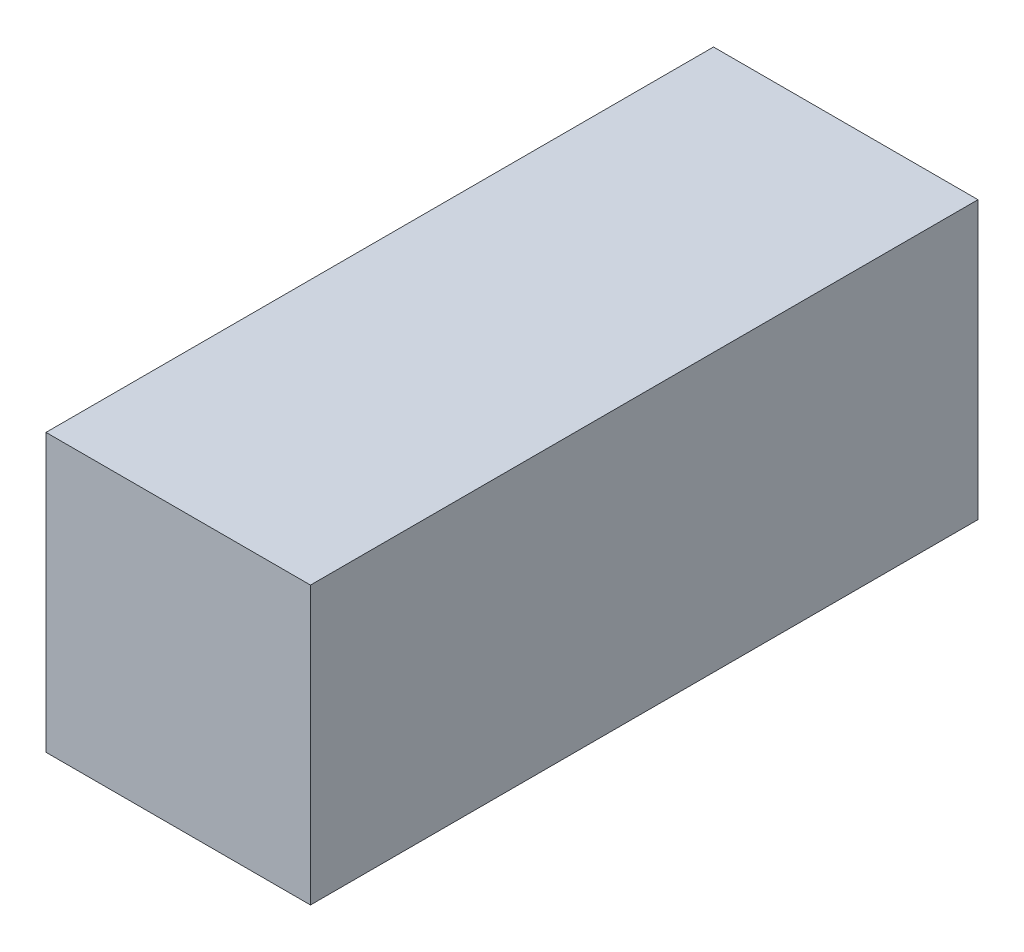
ISO-10303-21;
HEADER;
FILE_DESCRIPTION(('STEP AP214'),'2;1');
FILE_NAME('part.step','',(''),(''),'','','');
FILE_SCHEMA(('AUTOMOTIVE_DESIGN { 1 0 10303 214 1 1 1 1 }'));
ENDSEC;
DATA;
#1=APPLICATION_CONTEXT('core data for automotive mechanical design processes');
#2=APPLICATION_PROTOCOL_DEFINITION('international standard','automotive_design',2000,#1);
#3=PRODUCT_CONTEXT('',#1,'mechanical');
#4=PRODUCT('Part','Part','',(#3));
#5=PRODUCT_RELATED_PRODUCT_CATEGORY('part','',(#4));
#6=PRODUCT_DEFINITION_FORMATION('','',#4);
#7=PRODUCT_DEFINITION_CONTEXT('part definition',#1,'design');
#8=PRODUCT_DEFINITION('design','',#6,#7);
#9=PRODUCT_DEFINITION_SHAPE('','',#8);
#10=(LENGTH_UNIT() NAMED_UNIT(*) SI_UNIT(.MILLI.,.METRE.));
#11=(NAMED_UNIT(*) PLANE_ANGLE_UNIT() SI_UNIT($,.RADIAN.));
#12=(NAMED_UNIT(*) SI_UNIT($,.STERADIAN.) SOLID_ANGLE_UNIT());
#13=UNCERTAINTY_MEASURE_WITH_UNIT(LENGTH_MEASURE(1.E-05),#10,'distance_accuracy_value','');
#14=(GEOMETRIC_REPRESENTATION_CONTEXT(3) GLOBAL_UNCERTAINTY_ASSIGNED_CONTEXT((#13)) GLOBAL_UNIT_ASSIGNED_CONTEXT((#10,
#11,#12)) REPRESENTATION_CONTEXT('',''));
#15=CARTESIAN_POINT('',(0.,0.,0.));
#16=DIRECTION('',(0.,0.,1.));
#17=DIRECTION('',(1.,0.,0.));
#18=AXIS2_PLACEMENT_3D('',#15,#16,#17);
#19=CARTESIAN_POINT('',(0.,22.,0.));
#20=DIRECTION('',(1.,0.,0.));
#21=DIRECTION('',(0.,0.,-1.));
#22=AXIS2_PLACEMENT_3D('',#19,#20,#21);
#23=PLANE('',#22);
#24=DIRECTION('',(0.,0.,1.));
#25=VECTOR('',#24,1.);
#26=CARTESIAN_POINT('',(0.,0.,0.));
#27=LINE('',#26,#25);
#28=CARTESIAN_POINT('',(0.,0.,0.));
#29=VERTEX_POINT('',#28);
#30=CARTESIAN_POINT('',(0.,0.,53.));
#31=VERTEX_POINT('',#30);
#32=EDGE_CURVE('E105',#29,#31,#27,.T.);
#33=ORIENTED_EDGE('',*,*,#32,.T.);
#34=DIRECTION('',(0.,-1.,0.));
#35=VECTOR('',#34,1.);
#36=CARTESIAN_POINT('',(0.,22.,53.));
#37=LINE('',#36,#35);
#38=CARTESIAN_POINT('',(0.,22.,53.));
#39=VERTEX_POINT('',#38);
#40=EDGE_CURVE('E11',#39,#31,#37,.T.);
#41=ORIENTED_EDGE('',*,*,#40,.F.);
#42=DIRECTION('',(0.,0.,1.));
#43=VECTOR('',#42,1.);
#44=CARTESIAN_POINT('',(0.,22.,0.));
#45=LINE('',#44,#43);
#46=CARTESIAN_POINT('',(0.,22.,0.));
#47=VERTEX_POINT('',#46);
#48=EDGE_CURVE('E89',#47,#39,#45,.T.);
#49=ORIENTED_EDGE('',*,*,#48,.F.);
#50=DIRECTION('',(0.,-1.,0.));
#51=VECTOR('',#50,1.);
#52=CARTESIAN_POINT('',(0.,22.,0.));
#53=LINE('',#52,#51);
#54=EDGE_CURVE('E97',#47,#29,#53,.T.);
#55=ORIENTED_EDGE('',*,*,#54,.T.);
#56=EDGE_LOOP('',(#33,#41,#49,#55));
#57=FACE_BOUND('',#56,.T.);
#58=ADVANCED_FACE('F39',(#57),#23,.F.);
#59=CARTESIAN_POINT('',(0.,22.,53.));
#60=DIRECTION('',(0.,0.,-1.));
#61=DIRECTION('',(-1.,0.,0.));
#62=AXIS2_PLACEMENT_3D('',#59,#60,#61);
#63=PLANE('',#62);
#64=DIRECTION('',(1.,0.,0.));
#65=VECTOR('',#64,1.);
#66=CARTESIAN_POINT('',(0.,0.,53.));
#67=LINE('',#66,#65);
#68=CARTESIAN_POINT('',(21.,0.,53.));
#69=VERTEX_POINT('',#68);
#70=EDGE_CURVE('E92',#31,#69,#67,.T.);
#71=ORIENTED_EDGE('',*,*,#70,.T.);
#72=DIRECTION('',(0.,-1.,0.));
#73=VECTOR('',#72,1.);
#74=CARTESIAN_POINT('',(21.,22.,53.));
#75=LINE('',#74,#73);
#76=CARTESIAN_POINT('',(21.,22.,53.));
#77=VERTEX_POINT('',#76);
#78=EDGE_CURVE('E50',#77,#69,#75,.T.);
#79=ORIENTED_EDGE('',*,*,#78,.F.);
#80=DIRECTION('',(1.,0.,0.));
#81=VECTOR('',#80,1.);
#82=CARTESIAN_POINT('',(0.,22.,53.));
#83=LINE('',#82,#81);
#84=EDGE_CURVE('E82',#39,#77,#83,.T.);
#85=ORIENTED_EDGE('',*,*,#84,.F.);
#86=ORIENTED_EDGE('',*,*,#40,.T.);
#87=EDGE_LOOP('',(#71,#79,#85,#86));
#88=FACE_BOUND('',#87,.T.);
#89=ADVANCED_FACE('F93',(#88),#63,.F.);
#90=CARTESIAN_POINT('',(21.,22.,0.));
#91=DIRECTION('',(-1.,0.,0.));
#92=DIRECTION('',(0.,0.,1.));
#93=AXIS2_PLACEMENT_3D('',#90,#91,#92);
#94=PLANE('',#93);
#95=DIRECTION('',(0.,0.,-1.));
#96=VECTOR('',#95,1.);
#97=CARTESIAN_POINT('',(21.,0.,0.));
#98=LINE('',#97,#96);
#99=CARTESIAN_POINT('',(21.,0.,0.));
#100=VERTEX_POINT('',#99);
#101=EDGE_CURVE('E75',#69,#100,#98,.T.);
#102=ORIENTED_EDGE('',*,*,#101,.T.);
#103=DIRECTION('',(0.,-1.,0.));
#104=VECTOR('',#103,1.);
#105=CARTESIAN_POINT('',(21.,22.,0.));
#106=LINE('',#105,#104);
#107=CARTESIAN_POINT('',(21.,22.,0.));
#108=VERTEX_POINT('',#107);
#109=EDGE_CURVE('E94',#108,#100,#106,.T.);
#110=ORIENTED_EDGE('',*,*,#109,.F.);
#111=DIRECTION('',(0.,0.,-1.));
#112=VECTOR('',#111,1.);
#113=CARTESIAN_POINT('',(21.,22.,0.));
#114=LINE('',#113,#112);
#115=EDGE_CURVE('E88',#77,#108,#114,.T.);
#116=ORIENTED_EDGE('',*,*,#115,.F.);
#117=ORIENTED_EDGE('',*,*,#78,.T.);
#118=EDGE_LOOP('',(#102,#110,#116,#117));
#119=FACE_BOUND('',#118,.T.);
#120=ADVANCED_FACE('F96',(#119),#94,.F.);
#121=CARTESIAN_POINT('',(0.,22.,0.));
#122=DIRECTION('',(0.,0.,1.));
#123=DIRECTION('',(1.,0.,0.));
#124=AXIS2_PLACEMENT_3D('',#121,#122,#123);
#125=PLANE('',#124);
#126=DIRECTION('',(-1.,0.,0.));
#127=VECTOR('',#126,1.);
#128=CARTESIAN_POINT('',(0.,0.,0.));
#129=LINE('',#128,#127);
#130=EDGE_CURVE('E76',#100,#29,#129,.T.);
#131=ORIENTED_EDGE('',*,*,#130,.T.);
#132=ORIENTED_EDGE('',*,*,#54,.F.);
#133=DIRECTION('',(-1.,0.,0.));
#134=VECTOR('',#133,1.);
#135=CARTESIAN_POINT('',(0.,22.,0.));
#136=LINE('',#135,#134);
#137=EDGE_CURVE('E54',#108,#47,#136,.T.);
#138=ORIENTED_EDGE('',*,*,#137,.F.);
#139=ORIENTED_EDGE('',*,*,#109,.T.);
#140=EDGE_LOOP('',(#131,#132,#138,#139));
#141=FACE_BOUND('',#140,.T.);
#142=ADVANCED_FACE('F109',(#141),#125,.F.);
#143=CARTESIAN_POINT('',(0.,22.,0.));
#144=DIRECTION('',(0.,1.,0.));
#145=DIRECTION('',(0.,0.,1.));
#146=AXIS2_PLACEMENT_3D('',#143,#144,#145);
#147=PLANE('',#146);
#148=ORIENTED_EDGE('',*,*,#48,.T.);
#149=ORIENTED_EDGE('',*,*,#84,.T.);
#150=ORIENTED_EDGE('',*,*,#115,.T.);
#151=ORIENTED_EDGE('',*,*,#137,.T.);
#152=EDGE_LOOP('',(#148,#149,#150,#151));
#153=FACE_BOUND('',#152,.T.);
#154=ADVANCED_FACE('F86',(#153),#147,.T.);
#155=CARTESIAN_POINT('',(0.,0.,0.));
#156=DIRECTION('',(0.,1.,0.));
#157=DIRECTION('',(0.,0.,1.));
#158=AXIS2_PLACEMENT_3D('',#155,#156,#157);
#159=PLANE('',#158);
#160=ORIENTED_EDGE('',*,*,#32,.F.);
#161=ORIENTED_EDGE('',*,*,#130,.F.);
#162=ORIENTED_EDGE('',*,*,#101,.F.);
#163=ORIENTED_EDGE('',*,*,#70,.F.);
#164=EDGE_LOOP('',(#160,#161,#162,#163));
#165=FACE_BOUND('',#164,.T.);
#166=ADVANCED_FACE('F115',(#165),#159,.F.);
#167=CLOSED_SHELL('',(#58,#89,#120,#142,#154,#166));
#168=MANIFOLD_SOLID_BREP('B2',#167);
#169=ADVANCED_BREP_SHAPE_REPRESENTATION('',(#18,#168),#14);
#170=SHAPE_DEFINITION_REPRESENTATION(#9,#169);
ENDSEC;
END-ISO-10303-21;
